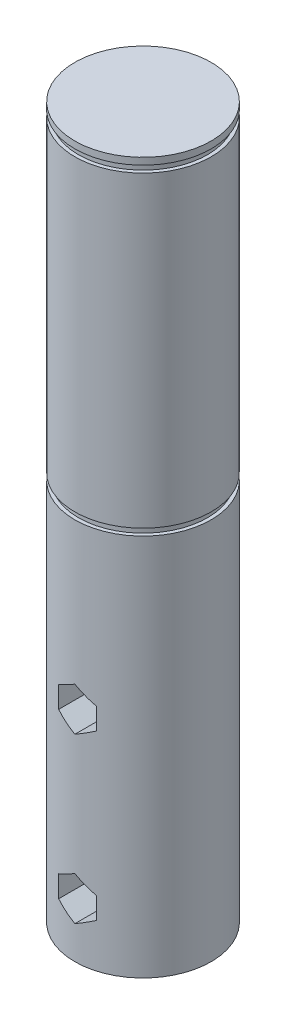
ISO-10303-21;
HEADER;
FILE_DESCRIPTION(('STEP AP214'),'2;1');
FILE_NAME('part.step','',(''),(''),'','','');
FILE_SCHEMA(('AUTOMOTIVE_DESIGN { 1 0 10303 214 1 1 1 1 }'));
ENDSEC;
DATA;
#1=APPLICATION_CONTEXT('core data for automotive mechanical design processes');
#2=APPLICATION_PROTOCOL_DEFINITION('international standard','automotive_design',2000,#1);
#3=PRODUCT_CONTEXT('',#1,'mechanical');
#4=PRODUCT('Part','Part','',(#3));
#5=PRODUCT_RELATED_PRODUCT_CATEGORY('part','',(#4));
#6=PRODUCT_DEFINITION_FORMATION('','',#4);
#7=PRODUCT_DEFINITION_CONTEXT('part definition',#1,'design');
#8=PRODUCT_DEFINITION('design','',#6,#7);
#9=PRODUCT_DEFINITION_SHAPE('','',#8);
#10=(LENGTH_UNIT() NAMED_UNIT(*) SI_UNIT(.MILLI.,.METRE.));
#11=(NAMED_UNIT(*) PLANE_ANGLE_UNIT() SI_UNIT($,.RADIAN.));
#12=(NAMED_UNIT(*) SI_UNIT($,.STERADIAN.) SOLID_ANGLE_UNIT());
#13=UNCERTAINTY_MEASURE_WITH_UNIT(LENGTH_MEASURE(1.E-05),#10,'distance_accuracy_value','');
#14=(GEOMETRIC_REPRESENTATION_CONTEXT(3) GLOBAL_UNCERTAINTY_ASSIGNED_CONTEXT((#13)) GLOBAL_UNIT_ASSIGNED_CONTEXT((#10,
#11,#12)) REPRESENTATION_CONTEXT('',''));
#15=CARTESIAN_POINT('',(0.,0.,0.));
#16=DIRECTION('',(0.,0.,1.));
#17=DIRECTION('',(1.,0.,0.));
#18=AXIS2_PLACEMENT_3D('',#15,#16,#17);
#19=CARTESIAN_POINT('',(5.9,40.,0.));
#20=DIRECTION('',(0.,-1.,0.));
#21=DIRECTION('',(0.,0.,-1.));
#22=AXIS2_PLACEMENT_3D('',#19,#20,#21);
#23=CYLINDRICAL_SURFACE('',#22,9.975);
#24=DIRECTION('',(0.,-1.,0.));
#25=VECTOR('',#24,1.);
#26=CARTESIAN_POINT('',(3.15000000000001,40.,9.58843704677671));
#27=LINE('',#26,#25);
#28=CARTESIAN_POINT('',(3.15000000000002,6.41228675972853,9.58843704677671));
#29=VERTEX_POINT('',#28);
#30=CARTESIAN_POINT('',(3.15000000000002,9.58771324027147,9.58843704677671));
#31=VERTEX_POINT('',#30);
#32=EDGE_CURVE('E238',#29,#31,#27,.F.);
#33=ORIENTED_EDGE('',*,*,#32,.T.);
#34=CARTESIAN_POINT('',(5.9,11.1754264805429,0.));
#35=DIRECTION('',(-0.5,0.866025403784439,0.));
#36=DIRECTION('',(-0.866025403784439,-0.5,0.));
#37=AXIS2_PLACEMENT_3D('',#34,#35,#36);
#38=ELLIPSE('',#37,11.518137870333,9.975);
#39=CARTESIAN_POINT('',(5.90000000000001,11.1754264805429,9.975));
#40=VERTEX_POINT('',#39);
#41=EDGE_CURVE('E244',#31,#40,#38,.T.);
#42=ORIENTED_EDGE('',*,*,#41,.T.);
#43=CARTESIAN_POINT('',(5.9,11.1754264805429,0.));
#44=DIRECTION('',(0.5,0.866025403784439,0.));
#45=DIRECTION('',(0.866025403784439,-0.5,0.));
#46=AXIS2_PLACEMENT_3D('',#43,#44,#45);
#47=ELLIPSE('',#46,11.518137870333,9.975);
#48=CARTESIAN_POINT('',(8.65000000000001,9.58771324027147,9.5884370467767));
#49=VERTEX_POINT('',#48);
#50=EDGE_CURVE('E229',#40,#49,#47,.T.);
#51=ORIENTED_EDGE('',*,*,#50,.T.);
#52=DIRECTION('',(0.,-1.,0.));
#53=VECTOR('',#52,1.);
#54=CARTESIAN_POINT('',(8.65000000000001,40.,9.5884370467767));
#55=LINE('',#54,#53);
#56=CARTESIAN_POINT('',(8.65000000000001,6.41228675972853,9.5884370467767));
#57=VERTEX_POINT('',#56);
#58=EDGE_CURVE('E235',#49,#57,#55,.T.);
#59=ORIENTED_EDGE('',*,*,#58,.T.);
#60=CARTESIAN_POINT('',(5.9,4.82457351945705,0.));
#61=DIRECTION('',(0.5,-0.866025403784439,0.));
#62=DIRECTION('',(-0.866025403784439,-0.5,0.));
#63=AXIS2_PLACEMENT_3D('',#60,#61,#62);
#64=ELLIPSE('',#63,11.518137870333,9.975);
#65=CARTESIAN_POINT('',(5.90000000000001,4.82457351945706,9.975));
#66=VERTEX_POINT('',#65);
#67=EDGE_CURVE('E241',#57,#66,#64,.T.);
#68=ORIENTED_EDGE('',*,*,#67,.T.);
#69=CARTESIAN_POINT('',(5.9,4.82457351945707,0.));
#70=DIRECTION('',(-0.5,-0.866025403784439,0.));
#71=DIRECTION('',(0.866025403784439,-0.5,0.));
#72=AXIS2_PLACEMENT_3D('',#69,#70,#71);
#73=ELLIPSE('',#72,11.518137870333,9.975);
#74=EDGE_CURVE('E232',#66,#29,#73,.T.);
#75=ORIENTED_EDGE('',*,*,#74,.T.);
#76=EDGE_LOOP('',(#33,#42,#51,#59,#68,#75));
#77=FACE_BOUND('',#76,.T.);
#78=CARTESIAN_POINT('',(5.9,0.,0.));
#79=DIRECTION('',(0.,1.,0.));
#80=DIRECTION('',(0.,0.,1.));
#81=AXIS2_PLACEMENT_3D('',#78,#79,#80);
#82=CIRCLE('',#81,9.975);
#83=CARTESIAN_POINT('',(5.9,0.,9.975));
#84=VERTEX_POINT('',#83);
#85=EDGE_CURVE('E226',#84,#84,#82,.T.);
#86=ORIENTED_EDGE('',*,*,#85,.T.);
#87=EDGE_LOOP('',(#86));
#88=FACE_BOUND('',#87,.T.);
#89=CARTESIAN_POINT('',(5.9,56.,0.));
#90=DIRECTION('',(0.,1.,0.));
#91=DIRECTION('',(0.,0.,1.));
#92=AXIS2_PLACEMENT_3D('',#89,#90,#91);
#93=CIRCLE('',#92,9.975);
#94=CARTESIAN_POINT('',(5.9,56.,9.975));
#95=VERTEX_POINT('',#94);
#96=EDGE_CURVE('E221',#95,#95,#93,.T.);
#97=ORIENTED_EDGE('',*,*,#96,.F.);
#98=EDGE_LOOP('',(#97));
#99=FACE_BOUND('',#98,.T.);
#100=CARTESIAN_POINT('',(5.9,35.1754264805429,0.));
#101=DIRECTION('',(0.5,-0.866025403784439,0.));
#102=DIRECTION('',(-0.866025403784439,-0.5,0.));
#103=AXIS2_PLACEMENT_3D('',#100,#101,#102);
#104=ELLIPSE('',#103,11.518137870333,9.975);
#105=CARTESIAN_POINT('',(5.90000000000001,35.1754264805429,9.975));
#106=VERTEX_POINT('',#105);
#107=CARTESIAN_POINT('',(3.15000000000002,33.5877132402715,9.58843704677671));
#108=VERTEX_POINT('',#107);
#109=EDGE_CURVE('E11',#106,#108,#104,.T.);
#110=ORIENTED_EDGE('',*,*,#109,.F.);
#111=CARTESIAN_POINT('',(5.9,35.1754264805429,0.));
#112=DIRECTION('',(-0.5,-0.866025403784439,0.));
#113=DIRECTION('',(0.866025403784439,-0.5,0.));
#114=AXIS2_PLACEMENT_3D('',#111,#112,#113);
#115=ELLIPSE('',#114,11.518137870333,9.975);
#116=CARTESIAN_POINT('',(8.65000000000001,33.5877132402715,9.5884370467767));
#117=VERTEX_POINT('',#116);
#118=EDGE_CURVE('E247',#117,#106,#115,.T.);
#119=ORIENTED_EDGE('',*,*,#118,.F.);
#120=DIRECTION('',(0.,-1.,0.));
#121=VECTOR('',#120,1.);
#122=CARTESIAN_POINT('',(8.65000000000001,40.,9.5884370467767));
#123=LINE('',#122,#121);
#124=CARTESIAN_POINT('',(8.65000000000001,30.4122867597285,9.5884370467767));
#125=VERTEX_POINT('',#124);
#126=EDGE_CURVE('E139',#125,#117,#123,.F.);
#127=ORIENTED_EDGE('',*,*,#126,.F.);
#128=CARTESIAN_POINT('',(5.9,28.8245735194571,0.));
#129=DIRECTION('',(-0.5,0.866025403784439,0.));
#130=DIRECTION('',(-0.866025403784439,-0.5,0.));
#131=AXIS2_PLACEMENT_3D('',#128,#129,#130);
#132=ELLIPSE('',#131,11.518137870333,9.975);
#133=CARTESIAN_POINT('',(5.90000000000001,28.8245735194571,9.975));
#134=VERTEX_POINT('',#133);
#135=EDGE_CURVE('E44',#134,#125,#132,.T.);
#136=ORIENTED_EDGE('',*,*,#135,.F.);
#137=CARTESIAN_POINT('',(5.9,28.8245735194571,0.));
#138=DIRECTION('',(0.5,0.866025403784439,0.));
#139=DIRECTION('',(0.866025403784439,-0.5,0.));
#140=AXIS2_PLACEMENT_3D('',#137,#138,#139);
#141=ELLIPSE('',#140,11.518137870333,9.975);
#142=CARTESIAN_POINT('',(3.15000000000002,30.4122867597285,9.58843704677671));
#143=VERTEX_POINT('',#142);
#144=EDGE_CURVE('E249',#143,#134,#141,.T.);
#145=ORIENTED_EDGE('',*,*,#144,.F.);
#146=DIRECTION('',(0.,-1.,0.));
#147=VECTOR('',#146,1.);
#148=CARTESIAN_POINT('',(3.15000000000002,40.,9.58843704677671));
#149=LINE('',#148,#147);
#150=EDGE_CURVE('E252',#108,#143,#149,.T.);
#151=ORIENTED_EDGE('',*,*,#150,.F.);
#152=EDGE_LOOP('',(#110,#119,#127,#136,#145,#151));
#153=FACE_BOUND('',#152,.T.);
#154=ADVANCED_FACE('F37',(#77,#88,#99,#153),#23,.T.);
#155=CARTESIAN_POINT('',(5.9,0.,0.));
#156=DIRECTION('',(0.,1.,0.));
#157=DIRECTION('',(0.,0.,1.));
#158=AXIS2_PLACEMENT_3D('',#155,#156,#157);
#159=PLANE('',#158);
#160=ORIENTED_EDGE('',*,*,#85,.F.);
#161=EDGE_LOOP('',(#160));
#162=FACE_BOUND('',#161,.T.);
#163=ADVANCED_FACE('F279',(#162),#159,.F.);
#164=CARTESIAN_POINT('',(5.9,56.,0.));
#165=DIRECTION('',(0.,1.,0.));
#166=DIRECTION('',(0.,0.,1.));
#167=AXIS2_PLACEMENT_3D('',#164,#165,#166);
#168=PLANE('',#167);
#169=CARTESIAN_POINT('',(5.9,56.,0.));
#170=DIRECTION('',(0.,1.,0.));
#171=DIRECTION('',(0.,0.,1.));
#172=AXIS2_PLACEMENT_3D('',#169,#170,#171);
#173=CIRCLE('',#172,9.45);
#174=CARTESIAN_POINT('',(5.9,56.,9.45));
#175=VERTEX_POINT('',#174);
#176=EDGE_CURVE('E215',#175,#175,#173,.T.);
#177=ORIENTED_EDGE('',*,*,#176,.F.);
#178=EDGE_LOOP('',(#177));
#179=FACE_BOUND('',#178,.T.);
#180=ORIENTED_EDGE('',*,*,#96,.T.);
#181=EDGE_LOOP('',(#180));
#182=FACE_BOUND('',#181,.T.);
#183=ADVANCED_FACE('F284',(#179,#182),#168,.T.);
#184=CARTESIAN_POINT('',(5.9,57.,0.));
#185=DIRECTION('',(0.,-1.,0.));
#186=DIRECTION('',(0.,0.,-1.));
#187=AXIS2_PLACEMENT_3D('',#184,#185,#186);
#188=CYLINDRICAL_SURFACE('',#187,9.45);
#189=CARTESIAN_POINT('',(5.9,57.,0.));
#190=DIRECTION('',(0.,1.,0.));
#191=DIRECTION('',(0.,0.,1.));
#192=AXIS2_PLACEMENT_3D('',#189,#190,#191);
#193=CIRCLE('',#192,9.45);
#194=CARTESIAN_POINT('',(5.9,57.,9.45));
#195=VERTEX_POINT('',#194);
#196=EDGE_CURVE('E218',#195,#195,#193,.T.);
#197=ORIENTED_EDGE('',*,*,#196,.F.);
#198=EDGE_LOOP('',(#197));
#199=FACE_BOUND('',#198,.T.);
#200=ORIENTED_EDGE('',*,*,#176,.T.);
#201=EDGE_LOOP('',(#200));
#202=FACE_BOUND('',#201,.T.);
#203=ADVANCED_FACE('F292',(#199,#202),#188,.T.);
#204=CARTESIAN_POINT('',(5.9,102.,0.));
#205=DIRECTION('',(0.,-1.,0.));
#206=DIRECTION('',(0.,0.,-1.));
#207=AXIS2_PLACEMENT_3D('',#204,#205,#206);
#208=CYLINDRICAL_SURFACE('',#207,9.975);
#209=CARTESIAN_POINT('',(5.9,102.,0.));
#210=DIRECTION('',(0.,1.,0.));
#211=DIRECTION('',(0.,0.,1.));
#212=AXIS2_PLACEMENT_3D('',#209,#210,#211);
#213=CIRCLE('',#212,9.975);
#214=CARTESIAN_POINT('',(5.9,102.,-9.975));
#215=VERTEX_POINT('',#214);
#216=EDGE_CURVE('E212',#215,#215,#213,.T.);
#217=CARTESIAN_POINT('',(5.9,57.,0.));
#218=DIRECTION('',(0.,1.,0.));
#219=DIRECTION('',(0.,0.,1.));
#220=AXIS2_PLACEMENT_3D('',#217,#218,#219);
#221=CIRCLE('',#220,9.975);
#222=CARTESIAN_POINT('',(5.9,57.,-9.975));
#223=VERTEX_POINT('',#222);
#224=EDGE_CURVE('E209',#223,#223,#221,.T.);
#225=CARTESIAN_POINT('',(5.9,102.,-9.975));
#226=CARTESIAN_POINT('',(5.9,101.53125,-9.975));
#227=CARTESIAN_POINT('',(5.9,101.0625,-9.975));
#228=CARTESIAN_POINT('',(5.9,100.125,-9.975));
#229=CARTESIAN_POINT('',(5.9,99.65625,-9.975));
#230=CARTESIAN_POINT('',(5.9,98.71875,-9.975));
#231=CARTESIAN_POINT('',(5.9,98.25,-9.975));
#232=CARTESIAN_POINT('',(5.9,97.3125,-9.975));
#233=CARTESIAN_POINT('',(5.9,96.84375,-9.975));
#234=CARTESIAN_POINT('',(5.9,95.90625,-9.975));
#235=CARTESIAN_POINT('',(5.9,95.4375,-9.975));
#236=CARTESIAN_POINT('',(5.9,94.5,-9.975));
#237=CARTESIAN_POINT('',(5.9,94.03125,-9.975));
#238=CARTESIAN_POINT('',(5.9,93.09375,-9.975));
#239=CARTESIAN_POINT('',(5.9,92.625,-9.975));
#240=CARTESIAN_POINT('',(5.9,91.6875,-9.975));
#241=CARTESIAN_POINT('',(5.9,91.21875,-9.975));
#242=CARTESIAN_POINT('',(5.9,90.28125,-9.975));
#243=CARTESIAN_POINT('',(5.9,89.8125,-9.975));
#244=CARTESIAN_POINT('',(5.9,88.875,-9.975));
#245=CARTESIAN_POINT('',(5.9,88.40625,-9.975));
#246=CARTESIAN_POINT('',(5.9,87.46875,-9.975));
#247=CARTESIAN_POINT('',(5.9,87.,-9.975));
#248=CARTESIAN_POINT('',(5.9,86.0625,-9.975));
#249=CARTESIAN_POINT('',(5.9,85.59375,-9.975));
#250=CARTESIAN_POINT('',(5.9,84.65625,-9.975));
#251=CARTESIAN_POINT('',(5.9,84.1875,-9.975));
#252=CARTESIAN_POINT('',(5.9,83.25,-9.975));
#253=CARTESIAN_POINT('',(5.9,82.78125,-9.975));
#254=CARTESIAN_POINT('',(5.9,81.84375,-9.975));
#255=CARTESIAN_POINT('',(5.9,81.375,-9.975));
#256=CARTESIAN_POINT('',(5.9,80.4375,-9.975));
#257=CARTESIAN_POINT('',(5.9,79.96875,-9.975));
#258=CARTESIAN_POINT('',(5.9,79.03125,-9.975));
#259=CARTESIAN_POINT('',(5.9,78.5625,-9.975));
#260=CARTESIAN_POINT('',(5.9,77.625,-9.975));
#261=CARTESIAN_POINT('',(5.9,77.15625,-9.975));
#262=CARTESIAN_POINT('',(5.9,76.21875,-9.975));
#263=CARTESIAN_POINT('',(5.9,75.75,-9.975));
#264=CARTESIAN_POINT('',(5.9,74.8125,-9.975));
#265=CARTESIAN_POINT('',(5.9,74.34375,-9.975));
#266=CARTESIAN_POINT('',(5.9,73.40625,-9.975));
#267=CARTESIAN_POINT('',(5.9,72.9375,-9.975));
#268=CARTESIAN_POINT('',(5.9,72.,-9.975));
#269=CARTESIAN_POINT('',(5.9,71.53125,-9.975));
#270=CARTESIAN_POINT('',(5.9,70.59375,-9.975));
#271=CARTESIAN_POINT('',(5.9,70.125,-9.975));
#272=CARTESIAN_POINT('',(5.9,69.1875,-9.975));
#273=CARTESIAN_POINT('',(5.9,68.71875,-9.975));
#274=CARTESIAN_POINT('',(5.9,67.78125,-9.975));
#275=CARTESIAN_POINT('',(5.9,67.3125,-9.975));
#276=CARTESIAN_POINT('',(5.9,66.375,-9.975));
#277=CARTESIAN_POINT('',(5.9,65.90625,-9.975));
#278=CARTESIAN_POINT('',(5.9,64.96875,-9.975));
#279=CARTESIAN_POINT('',(5.9,64.5,-9.975));
#280=CARTESIAN_POINT('',(5.9,63.5625,-9.975));
#281=CARTESIAN_POINT('',(5.9,63.09375,-9.975));
#282=CARTESIAN_POINT('',(5.9,62.15625,-9.975));
#283=CARTESIAN_POINT('',(5.9,61.6875,-9.975));
#284=CARTESIAN_POINT('',(5.9,60.75,-9.975));
#285=CARTESIAN_POINT('',(5.9,60.28125,-9.975));
#286=CARTESIAN_POINT('',(5.9,59.34375,-9.975));
#287=CARTESIAN_POINT('',(5.9,58.875,-9.975));
#288=CARTESIAN_POINT('',(5.9,57.9375,-9.975));
#289=CARTESIAN_POINT('',(5.9,57.46875,-9.975));
#290=CARTESIAN_POINT('',(5.9,57.,-9.975));
#291=B_SPLINE_CURVE_WITH_KNOTS('',3,(#225,#226,#227,#228,#229,#230,#231,#232,#233,#234,#235,
#236,#237,#238,#239,#240,#241,#242,#243,#244,#245,#246,#247,#248,#249,#250,#251,#252,#253,#254,
#255,#256,#257,#258,#259,#260,#261,#262,#263,#264,#265,#266,#267,#268,#269,#270,#271,#272,#273,
#274,#275,#276,#277,#278,#279,#280,#281,#282,#283,#284,#285,#286,#287,#288,#289,#290),
.UNSPECIFIED.,.F.,.F.,(4,2,2,2,2,2,2,2,2,2,2,2,2,2,2,2,2,2,2,2,2,2,2,2,2,2,2,2,2,2,2,2,4),(0.,
1.40625,2.8125,4.21874999999999,5.62499999999999,7.03124999999999,8.43749999999999,9.84375,
11.25,12.65625,14.0625,15.46875,16.875,18.28125,19.6875,21.09375,22.5,23.90625,25.3125,26.71875,
28.125,29.53125,30.9375,32.34375,33.75,35.15625,36.5625,37.96875,39.375,40.78125,42.1875,
43.59375,45.),.UNSPECIFIED.);
#292=EDGE_CURVE('BSEAM298',#215,#223,#291,.T.);
#293=ORIENTED_EDGE('',*,*,#216,.F.);
#294=ORIENTED_EDGE('',*,*,#224,.T.);
#295=ORIENTED_EDGE('',*,*,#292,.T.);
#296=ORIENTED_EDGE('',*,*,#292,.F.);
#297=EDGE_LOOP('',(#293,#295,#294,#296));
#298=FACE_BOUND('',#297,.T.);
#299=ADVANCED_FACE('F298',(#298),#208,.T.);
#300=CARTESIAN_POINT('',(5.9,102.,0.));
#301=DIRECTION('',(0.,1.,0.));
#302=DIRECTION('',(0.,0.,1.));
#303=AXIS2_PLACEMENT_3D('',#300,#301,#302);
#304=PLANE('',#303);
#305=CARTESIAN_POINT('',(5.9,102.,0.));
#306=DIRECTION('',(0.,1.,0.));
#307=DIRECTION('',(0.,0.,1.));
#308=AXIS2_PLACEMENT_3D('',#305,#306,#307);
#309=CIRCLE('',#308,9.45);
#310=CARTESIAN_POINT('',(5.9,102.,9.45));
#311=VERTEX_POINT('',#310);
#312=EDGE_CURVE('E203',#311,#311,#309,.T.);
#313=ORIENTED_EDGE('',*,*,#312,.F.);
#314=EDGE_LOOP('',(#313));
#315=FACE_BOUND('',#314,.T.);
#316=ORIENTED_EDGE('',*,*,#216,.T.);
#317=EDGE_LOOP('',(#316));
#318=FACE_BOUND('',#317,.T.);
#319=ADVANCED_FACE('F305',(#315,#318),#304,.T.);
#320=CARTESIAN_POINT('',(5.9,57.,0.));
#321=DIRECTION('',(0.,1.,0.));
#322=DIRECTION('',(0.,0.,1.));
#323=AXIS2_PLACEMENT_3D('',#320,#321,#322);
#324=PLANE('',#323);
#325=ORIENTED_EDGE('',*,*,#196,.T.);
#326=EDGE_LOOP('',(#325));
#327=FACE_BOUND('',#326,.T.);
#328=ORIENTED_EDGE('',*,*,#224,.F.);
#329=EDGE_LOOP('',(#328));
#330=FACE_BOUND('',#329,.T.);
#331=ADVANCED_FACE('F307',(#327,#330),#324,.F.);
#332=CARTESIAN_POINT('',(5.9,103.,0.));
#333=DIRECTION('',(0.,-1.,0.));
#334=DIRECTION('',(0.,0.,-1.));
#335=AXIS2_PLACEMENT_3D('',#332,#333,#334);
#336=CYLINDRICAL_SURFACE('',#335,9.45);
#337=CARTESIAN_POINT('',(5.9,103.,0.));
#338=DIRECTION('',(0.,1.,0.));
#339=DIRECTION('',(0.,0.,1.));
#340=AXIS2_PLACEMENT_3D('',#337,#338,#339);
#341=CIRCLE('',#340,9.45);
#342=CARTESIAN_POINT('',(5.9,103.,9.45));
#343=VERTEX_POINT('',#342);
#344=EDGE_CURVE('E206',#343,#343,#341,.T.);
#345=ORIENTED_EDGE('',*,*,#344,.F.);
#346=EDGE_LOOP('',(#345));
#347=FACE_BOUND('',#346,.T.);
#348=ORIENTED_EDGE('',*,*,#312,.T.);
#349=EDGE_LOOP('',(#348));
#350=FACE_BOUND('',#349,.T.);
#351=ADVANCED_FACE('F310',(#347,#350),#336,.T.);
#352=CARTESIAN_POINT('',(5.9,104.,0.));
#353=DIRECTION('',(0.,-1.,0.));
#354=DIRECTION('',(0.,0.,-1.));
#355=AXIS2_PLACEMENT_3D('',#352,#353,#354);
#356=CYLINDRICAL_SURFACE('',#355,9.975);
#357=CARTESIAN_POINT('',(5.9,104.,0.));
#358=DIRECTION('',(0.,1.,0.));
#359=DIRECTION('',(0.,0.,1.));
#360=AXIS2_PLACEMENT_3D('',#357,#358,#359);
#361=CIRCLE('',#360,9.975);
#362=CARTESIAN_POINT('',(5.9,104.,9.975));
#363=VERTEX_POINT('',#362);
#364=EDGE_CURVE('E200',#363,#363,#361,.T.);
#365=ORIENTED_EDGE('',*,*,#364,.F.);
#366=EDGE_LOOP('',(#365));
#367=FACE_BOUND('',#366,.T.);
#368=CARTESIAN_POINT('',(5.9,103.,0.));
#369=DIRECTION('',(0.,1.,0.));
#370=DIRECTION('',(0.,0.,1.));
#371=AXIS2_PLACEMENT_3D('',#368,#369,#370);
#372=CIRCLE('',#371,9.975);
#373=CARTESIAN_POINT('',(5.9,103.,9.975));
#374=VERTEX_POINT('',#373);
#375=EDGE_CURVE('E186',#374,#374,#372,.T.);
#376=ORIENTED_EDGE('',*,*,#375,.T.);
#377=EDGE_LOOP('',(#376));
#378=FACE_BOUND('',#377,.T.);
#379=ADVANCED_FACE('F317',(#367,#378),#356,.T.);
#380=CARTESIAN_POINT('',(5.9,104.,0.));
#381=DIRECTION('',(0.,1.,0.));
#382=DIRECTION('',(0.,0.,1.));
#383=AXIS2_PLACEMENT_3D('',#380,#381,#382);
#384=PLANE('',#383);
#385=ORIENTED_EDGE('',*,*,#364,.T.);
#386=EDGE_LOOP('',(#385));
#387=FACE_BOUND('',#386,.T.);
#388=ADVANCED_FACE('F321',(#387),#384,.T.);
#389=CARTESIAN_POINT('',(5.9,103.,0.));
#390=DIRECTION('',(0.,1.,0.));
#391=DIRECTION('',(0.,0.,1.));
#392=AXIS2_PLACEMENT_3D('',#389,#390,#391);
#393=PLANE('',#392);
#394=ORIENTED_EDGE('',*,*,#344,.T.);
#395=EDGE_LOOP('',(#394));
#396=FACE_BOUND('',#395,.T.);
#397=ORIENTED_EDGE('',*,*,#375,.F.);
#398=EDGE_LOOP('',(#397));
#399=FACE_BOUND('',#398,.T.);
#400=ADVANCED_FACE('F323',(#396,#399),#393,.F.);
#401=CARTESIAN_POINT('',(8.65000000000001,6.41228675972853,1.975));
#402=DIRECTION('',(1.,0.,0.));
#403=DIRECTION('',(0.,0.,-1.));
#404=AXIS2_PLACEMENT_3D('',#401,#402,#403);
#405=PLANE('',#404);
#406=DIRECTION('',(0.,0.,1.));
#407=VECTOR('',#406,1.);
#408=CARTESIAN_POINT('',(8.65000000000001,9.58771324027147,1.975));
#409=LINE('',#408,#407);
#410=CARTESIAN_POINT('',(8.65000000000001,9.58771324027147,1.975));
#411=VERTEX_POINT('',#410);
#412=EDGE_CURVE('E59',#411,#49,#409,.T.);
#413=ORIENTED_EDGE('',*,*,#412,.F.);
#414=DIRECTION('',(0.,1.,0.));
#415=VECTOR('',#414,1.);
#416=CARTESIAN_POINT('',(8.65000000000001,6.41228675972853,1.975));
#417=LINE('',#416,#415);
#418=CARTESIAN_POINT('',(8.65000000000001,6.41228675972853,1.975));
#419=VERTEX_POINT('',#418);
#420=EDGE_CURVE('E155',#419,#411,#417,.T.);
#421=ORIENTED_EDGE('',*,*,#420,.F.);
#422=DIRECTION('',(0.,0.,1.));
#423=VECTOR('',#422,1.);
#424=CARTESIAN_POINT('',(8.65000000000001,6.41228675972853,1.975));
#425=LINE('',#424,#423);
#426=EDGE_CURVE('E183',#419,#57,#425,.T.);
#427=ORIENTED_EDGE('',*,*,#426,.T.);
#428=ORIENTED_EDGE('',*,*,#58,.F.);
#429=EDGE_LOOP('',(#413,#421,#427,#428));
#430=FACE_BOUND('',#429,.T.);
#431=ADVANCED_FACE('F326',(#430),#405,.F.);
#432=CARTESIAN_POINT('',(5.90000000000001,4.82457351945706,1.975));
#433=DIRECTION('',(0.5,-0.866025403784439,0.));
#434=DIRECTION('',(0.866025403784439,0.5,0.));
#435=AXIS2_PLACEMENT_3D('',#432,#433,#434);
#436=PLANE('',#435);
#437=ORIENTED_EDGE('',*,*,#426,.F.);
#438=DIRECTION('',(0.866025403784439,0.5,0.));
#439=VECTOR('',#438,1.);
#440=CARTESIAN_POINT('',(5.90000000000001,4.82457351945706,1.975));
#441=LINE('',#440,#439);
#442=CARTESIAN_POINT('',(5.90000000000001,4.82457351945706,1.975));
#443=VERTEX_POINT('',#442);
#444=EDGE_CURVE('E180',#443,#419,#441,.T.);
#445=ORIENTED_EDGE('',*,*,#444,.F.);
#446=DIRECTION('',(0.,0.,1.));
#447=VECTOR('',#446,1.);
#448=CARTESIAN_POINT('',(5.90000000000001,4.82457351945706,1.975));
#449=LINE('',#448,#447);
#450=EDGE_CURVE('E187',#443,#66,#449,.T.);
#451=ORIENTED_EDGE('',*,*,#450,.T.);
#452=ORIENTED_EDGE('',*,*,#67,.F.);
#453=EDGE_LOOP('',(#437,#445,#451,#452));
#454=FACE_BOUND('',#453,.T.);
#455=ADVANCED_FACE('F333',(#454),#436,.F.);
#456=CARTESIAN_POINT('',(3.15000000000002,6.41228675972853,1.975));
#457=DIRECTION('',(-0.5,-0.866025403784439,0.));
#458=DIRECTION('',(0.866025403784439,-0.5,0.));
#459=AXIS2_PLACEMENT_3D('',#456,#457,#458);
#460=PLANE('',#459);
#461=ORIENTED_EDGE('',*,*,#450,.F.);
#462=DIRECTION('',(0.866025403784439,-0.5,0.));
#463=VECTOR('',#462,1.);
#464=CARTESIAN_POINT('',(3.15000000000002,6.41228675972853,1.975));
#465=LINE('',#464,#463);
#466=CARTESIAN_POINT('',(3.15000000000002,6.41228675972853,1.975));
#467=VERTEX_POINT('',#466);
#468=EDGE_CURVE('E177',#467,#443,#465,.T.);
#469=ORIENTED_EDGE('',*,*,#468,.F.);
#470=DIRECTION('',(0.,0.,1.));
#471=VECTOR('',#470,1.);
#472=CARTESIAN_POINT('',(3.15000000000002,6.41228675972853,1.975));
#473=LINE('',#472,#471);
#474=EDGE_CURVE('E190',#467,#29,#473,.T.);
#475=ORIENTED_EDGE('',*,*,#474,.T.);
#476=ORIENTED_EDGE('',*,*,#74,.F.);
#477=EDGE_LOOP('',(#461,#469,#475,#476));
#478=FACE_BOUND('',#477,.T.);
#479=ADVANCED_FACE('F346',(#478),#460,.F.);
#480=CARTESIAN_POINT('',(3.15000000000002,9.58771324027147,1.975));
#481=DIRECTION('',(-1.,0.,0.));
#482=DIRECTION('',(0.,-1.,0.));
#483=AXIS2_PLACEMENT_3D('',#480,#481,#482);
#484=PLANE('',#483);
#485=ORIENTED_EDGE('',*,*,#474,.F.);
#486=DIRECTION('',(0.,-1.,0.));
#487=VECTOR('',#486,1.);
#488=CARTESIAN_POINT('',(3.15000000000002,9.58771324027147,1.975));
#489=LINE('',#488,#487);
#490=CARTESIAN_POINT('',(3.15000000000002,9.58771324027147,1.975));
#491=VERTEX_POINT('',#490);
#492=EDGE_CURVE('E174',#491,#467,#489,.T.);
#493=ORIENTED_EDGE('',*,*,#492,.F.);
#494=DIRECTION('',(0.,0.,1.));
#495=VECTOR('',#494,1.);
#496=CARTESIAN_POINT('',(3.15000000000002,9.58771324027147,1.975));
#497=LINE('',#496,#495);
#498=EDGE_CURVE('E193',#491,#31,#497,.T.);
#499=ORIENTED_EDGE('',*,*,#498,.T.);
#500=ORIENTED_EDGE('',*,*,#32,.F.);
#501=EDGE_LOOP('',(#485,#493,#499,#500));
#502=FACE_BOUND('',#501,.T.);
#503=ADVANCED_FACE('F342',(#502),#484,.F.);
#504=CARTESIAN_POINT('',(5.90000000000001,11.1754264805429,1.975));
#505=DIRECTION('',(-0.5,0.866025403784439,0.));
#506=DIRECTION('',(-0.866025403784439,-0.5,0.));
#507=AXIS2_PLACEMENT_3D('',#504,#505,#506);
#508=PLANE('',#507);
#509=ORIENTED_EDGE('',*,*,#498,.F.);
#510=DIRECTION('',(-0.866025403784439,-0.5,0.));
#511=VECTOR('',#510,1.);
#512=CARTESIAN_POINT('',(5.90000000000001,11.1754264805429,1.975));
#513=LINE('',#512,#511);
#514=CARTESIAN_POINT('',(5.90000000000001,11.1754264805429,1.975));
#515=VERTEX_POINT('',#514);
#516=EDGE_CURVE('E171',#515,#491,#513,.T.);
#517=ORIENTED_EDGE('',*,*,#516,.F.);
#518=DIRECTION('',(0.,0.,1.));
#519=VECTOR('',#518,1.);
#520=CARTESIAN_POINT('',(5.90000000000001,11.1754264805429,1.975));
#521=LINE('',#520,#519);
#522=EDGE_CURVE('E196',#515,#40,#521,.T.);
#523=ORIENTED_EDGE('',*,*,#522,.T.);
#524=ORIENTED_EDGE('',*,*,#41,.F.);
#525=EDGE_LOOP('',(#509,#517,#523,#524));
#526=FACE_BOUND('',#525,.T.);
#527=ADVANCED_FACE('F339',(#526),#508,.F.);
#528=CARTESIAN_POINT('',(8.65000000000001,9.58771324027147,1.975));
#529=DIRECTION('',(0.5,0.866025403784439,0.));
#530=DIRECTION('',(-0.866025403784439,0.5,0.));
#531=AXIS2_PLACEMENT_3D('',#528,#529,#530);
#532=PLANE('',#531);
#533=ORIENTED_EDGE('',*,*,#522,.F.);
#534=DIRECTION('',(-0.866025403784439,0.5,0.));
#535=VECTOR('',#534,1.);
#536=CARTESIAN_POINT('',(8.65000000000001,9.58771324027147,1.975));
#537=LINE('',#536,#535);
#538=EDGE_CURVE('E168',#411,#515,#537,.T.);
#539=ORIENTED_EDGE('',*,*,#538,.F.);
#540=ORIENTED_EDGE('',*,*,#412,.T.);
#541=ORIENTED_EDGE('',*,*,#50,.F.);
#542=EDGE_LOOP('',(#533,#539,#540,#541));
#543=FACE_BOUND('',#542,.T.);
#544=ADVANCED_FACE('F335',(#543),#532,.F.);
#545=CARTESIAN_POINT('',(0.,0.,1.975));
#546=DIRECTION('',(0.,0.,1.));
#547=DIRECTION('',(1.,0.,0.));
#548=AXIS2_PLACEMENT_3D('',#545,#546,#547);
#549=PLANE('',#548);
#550=ORIENTED_EDGE('',*,*,#420,.T.);
#551=ORIENTED_EDGE('',*,*,#538,.T.);
#552=ORIENTED_EDGE('',*,*,#516,.T.);
#553=ORIENTED_EDGE('',*,*,#492,.T.);
#554=ORIENTED_EDGE('',*,*,#468,.T.);
#555=ORIENTED_EDGE('',*,*,#444,.T.);
#556=EDGE_LOOP('',(#550,#551,#552,#553,#554,#555));
#557=FACE_BOUND('',#556,.T.);
#558=ADVANCED_FACE('F338',(#557),#549,.T.);
#559=CARTESIAN_POINT('',(8.65000000000001,33.5877132402715,1.975));
#560=DIRECTION('',(-1.,0.,0.));
#561=DIRECTION('',(0.,0.,1.));
#562=AXIS2_PLACEMENT_3D('',#559,#560,#561);
#563=PLANE('',#562);
#564=ORIENTED_EDGE('',*,*,#126,.T.);
#565=DIRECTION('',(0.,0.,1.));
#566=VECTOR('',#565,1.);
#567=CARTESIAN_POINT('',(8.65000000000001,33.5877132402715,1.975));
#568=LINE('',#567,#566);
#569=CARTESIAN_POINT('',(8.65000000000001,33.5877132402715,1.975));
#570=VERTEX_POINT('',#569);
#571=EDGE_CURVE('E51',#570,#117,#568,.T.);
#572=ORIENTED_EDGE('',*,*,#571,.F.);
#573=DIRECTION('',(0.,-1.,0.));
#574=VECTOR('',#573,1.);
#575=CARTESIAN_POINT('',(8.65000000000001,33.5877132402715,1.975));
#576=LINE('',#575,#574);
#577=CARTESIAN_POINT('',(8.65000000000001,30.4122867597285,1.975));
#578=VERTEX_POINT('',#577);
#579=EDGE_CURVE('E131',#570,#578,#576,.T.);
#580=ORIENTED_EDGE('',*,*,#579,.T.);
#581=DIRECTION('',(0.,0.,1.));
#582=VECTOR('',#581,1.);
#583=CARTESIAN_POINT('',(8.65000000000001,30.4122867597285,1.975));
#584=LINE('',#583,#582);
#585=EDGE_CURVE('E153',#578,#125,#584,.T.);
#586=ORIENTED_EDGE('',*,*,#585,.T.);
#587=EDGE_LOOP('',(#564,#572,#580,#586));
#588=FACE_BOUND('',#587,.T.);
#589=ADVANCED_FACE('F135',(#588),#563,.T.);
#590=CARTESIAN_POINT('',(8.65000000000001,30.4122867597285,1.975));
#591=DIRECTION('',(-0.5,0.866025403784439,0.));
#592=DIRECTION('',(-0.866025403784439,-0.5,0.));
#593=AXIS2_PLACEMENT_3D('',#590,#591,#592);
#594=PLANE('',#593);
#595=ORIENTED_EDGE('',*,*,#135,.T.);
#596=ORIENTED_EDGE('',*,*,#585,.F.);
#597=DIRECTION('',(-0.866025403784439,-0.5,0.));
#598=VECTOR('',#597,1.);
#599=CARTESIAN_POINT('',(8.65000000000001,30.4122867597285,1.975));
#600=LINE('',#599,#598);
#601=CARTESIAN_POINT('',(5.90000000000001,28.8245735194571,1.975));
#602=VERTEX_POINT('',#601);
#603=EDGE_CURVE('E141',#578,#602,#600,.T.);
#604=ORIENTED_EDGE('',*,*,#603,.T.);
#605=DIRECTION('',(0.,0.,1.));
#606=VECTOR('',#605,1.);
#607=CARTESIAN_POINT('',(5.90000000000001,28.8245735194571,1.975));
#608=LINE('',#607,#606);
#609=EDGE_CURVE('E156',#602,#134,#608,.T.);
#610=ORIENTED_EDGE('',*,*,#609,.T.);
#611=EDGE_LOOP('',(#595,#596,#604,#610));
#612=FACE_BOUND('',#611,.T.);
#613=ADVANCED_FACE('F255',(#612),#594,.T.);
#614=CARTESIAN_POINT('',(5.90000000000001,28.8245735194571,1.975));
#615=DIRECTION('',(0.5,0.866025403784439,0.));
#616=DIRECTION('',(-0.866025403784439,0.5,0.));
#617=AXIS2_PLACEMENT_3D('',#614,#615,#616);
#618=PLANE('',#617);
#619=ORIENTED_EDGE('',*,*,#144,.T.);
#620=ORIENTED_EDGE('',*,*,#609,.F.);
#621=DIRECTION('',(-0.866025403784439,0.5,0.));
#622=VECTOR('',#621,1.);
#623=CARTESIAN_POINT('',(5.90000000000001,28.8245735194571,1.975));
#624=LINE('',#623,#622);
#625=CARTESIAN_POINT('',(3.15000000000002,30.4122867597285,1.975));
#626=VERTEX_POINT('',#625);
#627=EDGE_CURVE('E150',#602,#626,#624,.T.);
#628=ORIENTED_EDGE('',*,*,#627,.T.);
#629=DIRECTION('',(0.,0.,1.));
#630=VECTOR('',#629,1.);
#631=CARTESIAN_POINT('',(3.15000000000002,30.4122867597285,1.975));
#632=LINE('',#631,#630);
#633=EDGE_CURVE('E159',#626,#143,#632,.T.);
#634=ORIENTED_EDGE('',*,*,#633,.T.);
#635=EDGE_LOOP('',(#619,#620,#628,#634));
#636=FACE_BOUND('',#635,.T.);
#637=ADVANCED_FACE('F269',(#636),#618,.T.);
#638=CARTESIAN_POINT('',(3.15000000000002,30.4122867597285,1.975));
#639=DIRECTION('',(1.,0.,0.));
#640=DIRECTION('',(0.,1.,0.));
#641=AXIS2_PLACEMENT_3D('',#638,#639,#640);
#642=PLANE('',#641);
#643=ORIENTED_EDGE('',*,*,#150,.T.);
#644=ORIENTED_EDGE('',*,*,#633,.F.);
#645=DIRECTION('',(0.,1.,0.));
#646=VECTOR('',#645,1.);
#647=CARTESIAN_POINT('',(3.15000000000002,30.4122867597285,1.975));
#648=LINE('',#647,#646);
#649=CARTESIAN_POINT('',(3.15000000000002,33.5877132402715,1.975));
#650=VERTEX_POINT('',#649);
#651=EDGE_CURVE('E148',#626,#650,#648,.T.);
#652=ORIENTED_EDGE('',*,*,#651,.T.);
#653=DIRECTION('',(0.,0.,1.));
#654=VECTOR('',#653,1.);
#655=CARTESIAN_POINT('',(3.15000000000002,33.5877132402715,1.975));
#656=LINE('',#655,#654);
#657=EDGE_CURVE('E162',#650,#108,#656,.T.);
#658=ORIENTED_EDGE('',*,*,#657,.T.);
#659=EDGE_LOOP('',(#643,#644,#652,#658));
#660=FACE_BOUND('',#659,.T.);
#661=ADVANCED_FACE('F267',(#660),#642,.T.);
#662=CARTESIAN_POINT('',(3.15000000000002,33.5877132402715,1.975));
#663=DIRECTION('',(0.5,-0.866025403784439,0.));
#664=DIRECTION('',(0.866025403784439,0.5,0.));
#665=AXIS2_PLACEMENT_3D('',#662,#663,#664);
#666=PLANE('',#665);
#667=ORIENTED_EDGE('',*,*,#109,.T.);
#668=ORIENTED_EDGE('',*,*,#657,.F.);
#669=DIRECTION('',(0.866025403784439,0.5,0.));
#670=VECTOR('',#669,1.);
#671=CARTESIAN_POINT('',(3.15000000000002,33.5877132402715,1.975));
#672=LINE('',#671,#670);
#673=CARTESIAN_POINT('',(5.90000000000001,35.1754264805429,1.975));
#674=VERTEX_POINT('',#673);
#675=EDGE_CURVE('E130',#650,#674,#672,.T.);
#676=ORIENTED_EDGE('',*,*,#675,.T.);
#677=DIRECTION('',(0.,0.,1.));
#678=VECTOR('',#677,1.);
#679=CARTESIAN_POINT('',(5.90000000000001,35.1754264805429,1.975));
#680=LINE('',#679,#678);
#681=EDGE_CURVE('E126',#674,#106,#680,.T.);
#682=ORIENTED_EDGE('',*,*,#681,.T.);
#683=EDGE_LOOP('',(#667,#668,#676,#682));
#684=FACE_BOUND('',#683,.T.);
#685=ADVANCED_FACE('F262',(#684),#666,.T.);
#686=CARTESIAN_POINT('',(5.90000000000001,35.1754264805429,1.975));
#687=DIRECTION('',(-0.5,-0.866025403784439,0.));
#688=DIRECTION('',(0.866025403784439,-0.5,0.));
#689=AXIS2_PLACEMENT_3D('',#686,#687,#688);
#690=PLANE('',#689);
#691=ORIENTED_EDGE('',*,*,#118,.T.);
#692=ORIENTED_EDGE('',*,*,#681,.F.);
#693=DIRECTION('',(0.866025403784439,-0.5,0.));
#694=VECTOR('',#693,1.);
#695=CARTESIAN_POINT('',(5.90000000000001,35.1754264805429,1.975));
#696=LINE('',#695,#694);
#697=EDGE_CURVE('E123',#674,#570,#696,.T.);
#698=ORIENTED_EDGE('',*,*,#697,.T.);
#699=ORIENTED_EDGE('',*,*,#571,.T.);
#700=EDGE_LOOP('',(#691,#692,#698,#699));
#701=FACE_BOUND('',#700,.T.);
#702=ADVANCED_FACE('F124',(#701),#690,.T.);
#703=CARTESIAN_POINT('',(0.,40.,1.975));
#704=DIRECTION('',(0.,0.,1.));
#705=DIRECTION('',(1.,0.,0.));
#706=AXIS2_PLACEMENT_3D('',#703,#704,#705);
#707=PLANE('',#706);
#708=ORIENTED_EDGE('',*,*,#579,.F.);
#709=ORIENTED_EDGE('',*,*,#697,.F.);
#710=ORIENTED_EDGE('',*,*,#675,.F.);
#711=ORIENTED_EDGE('',*,*,#651,.F.);
#712=ORIENTED_EDGE('',*,*,#627,.F.);
#713=ORIENTED_EDGE('',*,*,#603,.F.);
#714=EDGE_LOOP('',(#708,#709,#710,#711,#712,#713));
#715=FACE_BOUND('',#714,.T.);
#716=ADVANCED_FACE('F143',(#715),#707,.T.);
#717=CLOSED_SHELL('',(#154,#163,#183,#203,#299,#319,#331,#351,#379,#388,#400,#431,#455,#479,
#503,#527,#544,#558,#589,#613,#637,#661,#685,#702,#716));
#718=MANIFOLD_SOLID_BREP('B2',#717);
#719=ADVANCED_BREP_SHAPE_REPRESENTATION('',(#18,#718),#14);
#720=SHAPE_DEFINITION_REPRESENTATION(#9,#719);
ENDSEC;
END-ISO-10303-21;
